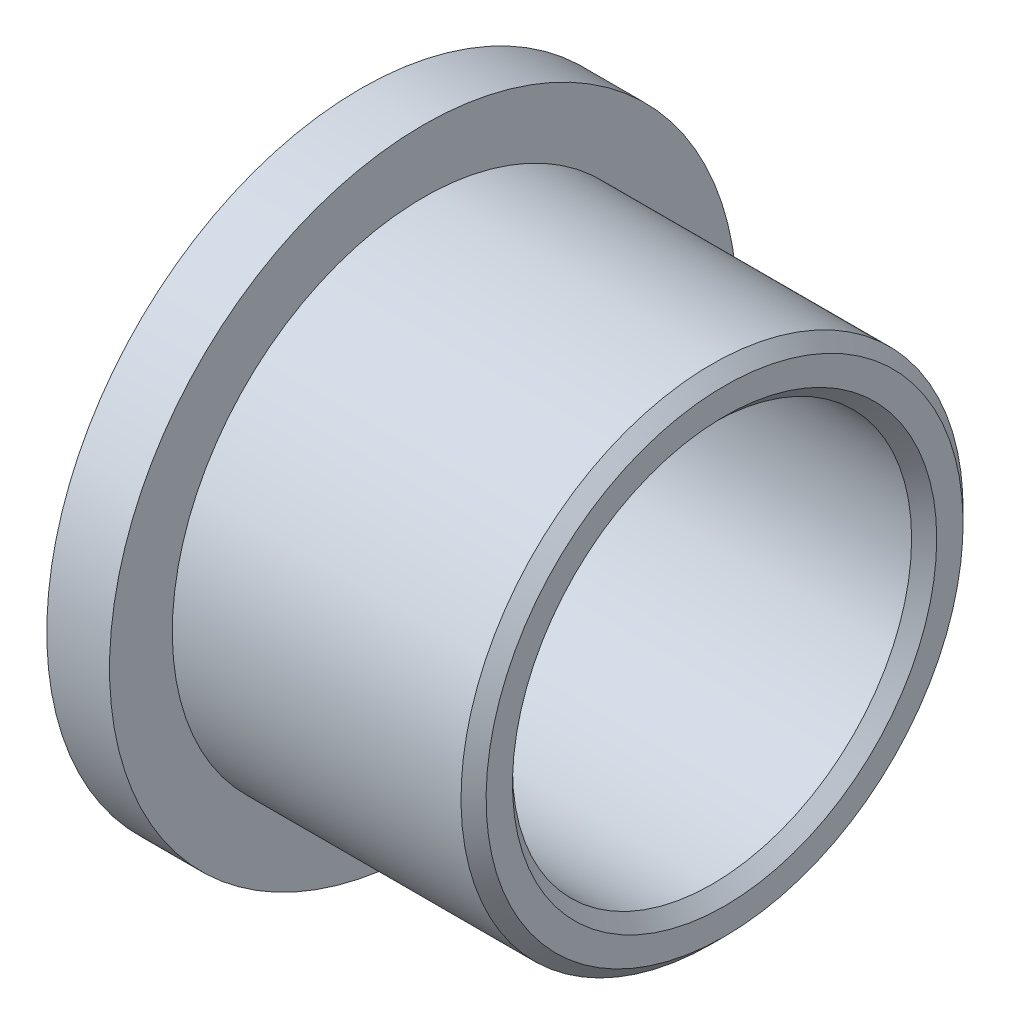
ISO-10303-21;
HEADER;
FILE_DESCRIPTION(('STEP AP214'),'2;1');
FILE_NAME('part.step','',(''),(''),'','','');
FILE_SCHEMA(('AUTOMOTIVE_DESIGN { 1 0 10303 214 1 1 1 1 }'));
ENDSEC;
DATA;
#1=APPLICATION_CONTEXT('core data for automotive mechanical design processes');
#2=APPLICATION_PROTOCOL_DEFINITION('international standard','automotive_design',2000,#1);
#3=PRODUCT_CONTEXT('',#1,'mechanical');
#4=PRODUCT('Part','Part','',(#3));
#5=PRODUCT_RELATED_PRODUCT_CATEGORY('part','',(#4));
#6=PRODUCT_DEFINITION_FORMATION('','',#4);
#7=PRODUCT_DEFINITION_CONTEXT('part definition',#1,'design');
#8=PRODUCT_DEFINITION('design','',#6,#7);
#9=PRODUCT_DEFINITION_SHAPE('','',#8);
#10=(LENGTH_UNIT() NAMED_UNIT(*) SI_UNIT(.MILLI.,.METRE.));
#11=(NAMED_UNIT(*) PLANE_ANGLE_UNIT() SI_UNIT($,.RADIAN.));
#12=(NAMED_UNIT(*) SI_UNIT($,.STERADIAN.) SOLID_ANGLE_UNIT());
#13=UNCERTAINTY_MEASURE_WITH_UNIT(LENGTH_MEASURE(1.E-05),#10,'distance_accuracy_value','');
#14=(GEOMETRIC_REPRESENTATION_CONTEXT(3) GLOBAL_UNCERTAINTY_ASSIGNED_CONTEXT((#13)) GLOBAL_UNIT_ASSIGNED_CONTEXT((#10,
#11,#12)) REPRESENTATION_CONTEXT('',''));
#15=CARTESIAN_POINT('',(0.,0.,0.));
#16=DIRECTION('',(0.,0.,1.));
#17=DIRECTION('',(1.,0.,0.));
#18=AXIS2_PLACEMENT_3D('',#15,#16,#17);
#19=CARTESIAN_POINT('',(0.,0.,0.));
#20=DIRECTION('',(1.,0.,0.));
#21=DIRECTION('',(0.,1.00000000000001,0.));
#22=AXIS2_PLACEMENT_3D('',#19,#20,#21);
#23=PLANE('',#22);
#24=CARTESIAN_POINT('',(0.,0.,0.));
#25=DIRECTION('',(1.,0.,0.));
#26=DIRECTION('',(0.,1.00000000000001,0.));
#27=AXIS2_PLACEMENT_3D('',#24,#25,#26);
#28=CIRCLE('',#27,8.45);
#29=CARTESIAN_POINT('',(0.,8.4500000000001,0.));
#30=VERTEX_POINT('',#29);
#31=EDGE_CURVE('E66',#30,#30,#28,.T.);
#32=ORIENTED_EDGE('',*,*,#31,.T.);
#33=EDGE_LOOP('',(#32));
#34=FACE_BOUND('',#33,.T.);
#35=CARTESIAN_POINT('',(0.,0.,0.));
#36=DIRECTION('',(-1.,0.,0.));
#37=DIRECTION('',(0.,-1.00000000000001,0.));
#38=AXIS2_PLACEMENT_3D('',#35,#36,#37);
#39=CIRCLE('',#38,12.5);
#40=CARTESIAN_POINT('',(0.,-12.5000000000001,0.));
#41=VERTEX_POINT('',#40);
#42=EDGE_CURVE('E69',#41,#41,#39,.T.);
#43=ORIENTED_EDGE('',*,*,#42,.T.);
#44=EDGE_LOOP('',(#43));
#45=FACE_BOUND('',#44,.T.);
#46=ADVANCED_FACE('F43',(#34,#45),#23,.F.);
#47=CARTESIAN_POINT('',(-19.5397532603566,1.04083408558608E-13,1.94289029309402E-13));
#48=DIRECTION('',(-1.,0.,0.));
#49=DIRECTION('',(0.,-1.00000000000001,0.));
#50=AXIS2_PLACEMENT_3D('',#47,#48,#49);
#51=CYLINDRICAL_SURFACE('',#50,12.5);
#52=ORIENTED_EDGE('',*,*,#42,.F.);
#53=EDGE_LOOP('',(#52));
#54=FACE_BOUND('',#53,.T.);
#55=CARTESIAN_POINT('',(2.5,0.,0.));
#56=DIRECTION('',(-1.,0.,0.));
#57=DIRECTION('',(0.,-1.00000000000001,0.));
#58=AXIS2_PLACEMENT_3D('',#55,#56,#57);
#59=CIRCLE('',#58,12.5);
#60=CARTESIAN_POINT('',(2.50000000000007,-12.5000000000001,0.));
#61=VERTEX_POINT('',#60);
#62=EDGE_CURVE('E72',#61,#61,#59,.T.);
#63=ORIENTED_EDGE('',*,*,#62,.T.);
#64=EDGE_LOOP('',(#63));
#65=FACE_BOUND('',#64,.T.);
#66=ADVANCED_FACE('F92',(#54,#65),#51,.T.);
#67=CARTESIAN_POINT('',(2.49999999999989,12.5000000000001,0.));
#68=DIRECTION('',(-1.,0.,0.));
#69=DIRECTION('',(0.,-1.00000000000001,0.));
#70=AXIS2_PLACEMENT_3D('',#67,#68,#69);
#71=PLANE('',#70);
#72=ORIENTED_EDGE('',*,*,#62,.F.);
#73=EDGE_LOOP('',(#72));
#74=FACE_BOUND('',#73,.T.);
#75=CARTESIAN_POINT('',(2.50000000000001,0.,0.));
#76=DIRECTION('',(-1.,0.,0.));
#77=DIRECTION('',(0.,-1.00000000000001,0.));
#78=AXIS2_PLACEMENT_3D('',#75,#76,#77);
#79=CIRCLE('',#78,10.);
#80=CARTESIAN_POINT('',(2.50000000000006,-10.0000000000001,0.));
#81=VERTEX_POINT('',#80);
#82=EDGE_CURVE('E75',#81,#81,#79,.T.);
#83=ORIENTED_EDGE('',*,*,#82,.T.);
#84=EDGE_LOOP('',(#83));
#85=FACE_BOUND('',#84,.T.);
#86=ADVANCED_FACE('F79',(#74,#85),#71,.F.);
#87=CARTESIAN_POINT('',(-19.5397532603566,1.04083408558608E-13,1.94289029309402E-13));
#88=DIRECTION('',(-1.,0.,0.));
#89=DIRECTION('',(0.,-1.00000000000001,0.));
#90=AXIS2_PLACEMENT_3D('',#87,#88,#89);
#91=CYLINDRICAL_SURFACE('',#90,9.99999999999999);
#92=CARTESIAN_POINT('',(14.,0.,0.));
#93=DIRECTION('',(-1.,0.,0.));
#94=DIRECTION('',(0.,-1.00000000000001,0.));
#95=AXIS2_PLACEMENT_3D('',#92,#93,#94);
#96=CIRCLE('',#95,9.99999999999999);
#97=CARTESIAN_POINT('',(14.,-10.0000000000001,0.));
#98=VERTEX_POINT('',#97);
#99=EDGE_CURVE('E54',#98,#98,#96,.T.);
#100=ORIENTED_EDGE('',*,*,#99,.T.);
#101=EDGE_LOOP('',(#100));
#102=FACE_BOUND('',#101,.T.);
#103=ORIENTED_EDGE('',*,*,#82,.F.);
#104=EDGE_LOOP('',(#103));
#105=FACE_BOUND('',#104,.T.);
#106=ADVANCED_FACE('F81',(#102,#105),#91,.T.);
#107=CARTESIAN_POINT('',(14.5,10.,0.));
#108=DIRECTION('',(-1.,0.,0.));
#109=DIRECTION('',(0.,-1.00000000000001,0.));
#110=AXIS2_PLACEMENT_3D('',#107,#108,#109);
#111=PLANE('',#110);
#112=CARTESIAN_POINT('',(14.5,0.,0.));
#113=DIRECTION('',(-1.,0.,0.));
#114=DIRECTION('',(0.,-1.00000000000001,0.));
#115=AXIS2_PLACEMENT_3D('',#112,#113,#114);
#116=CIRCLE('',#115,9.49999999999999);
#117=CARTESIAN_POINT('',(14.5000000000001,-9.50000000000009,0.));
#118=VERTEX_POINT('',#117);
#119=EDGE_CURVE('E12',#118,#118,#116,.F.);
#120=ORIENTED_EDGE('',*,*,#119,.T.);
#121=EDGE_LOOP('',(#120));
#122=FACE_BOUND('',#121,.T.);
#123=CARTESIAN_POINT('',(14.5,0.,0.));
#124=DIRECTION('',(-1.,0.,0.));
#125=DIRECTION('',(0.,-1.00000000000001,0.));
#126=AXIS2_PLACEMENT_3D('',#123,#124,#125);
#127=CIRCLE('',#126,8.45000000000001);
#128=CARTESIAN_POINT('',(14.5000000000001,-8.4500000000001,0.));
#129=VERTEX_POINT('',#128);
#130=EDGE_CURVE('E50',#129,#129,#127,.T.);
#131=ORIENTED_EDGE('',*,*,#130,.T.);
#132=EDGE_LOOP('',(#131));
#133=FACE_BOUND('',#132,.T.);
#134=ADVANCED_FACE('F83',(#122,#133),#111,.F.);
#135=CARTESIAN_POINT('',(14.5,0.,0.));
#136=DIRECTION('',(1.,0.,0.));
#137=DIRECTION('',(0.,0.,-1.));
#138=AXIS2_PLACEMENT_3D('',#135,#136,#137);
#139=CYLINDRICAL_SURFACE('',#138,7.95);
#140=CARTESIAN_POINT('',(0.500000000000007,0.,0.));
#141=DIRECTION('',(1.,0.,0.));
#142=DIRECTION('',(0.,0.,-1.));
#143=AXIS2_PLACEMENT_3D('',#140,#141,#142);
#144=CIRCLE('',#143,7.95);
#145=CARTESIAN_POINT('',(0.500000000000062,0.,-7.95));
#146=VERTEX_POINT('',#145);
#147=EDGE_CURVE('E58',#146,#146,#144,.F.);
#148=ORIENTED_EDGE('',*,*,#147,.T.);
#149=EDGE_LOOP('',(#148));
#150=FACE_BOUND('',#149,.T.);
#151=CARTESIAN_POINT('',(14.,0.,0.));
#152=DIRECTION('',(-1.,0.,0.));
#153=DIRECTION('',(0.,0.,1.));
#154=AXIS2_PLACEMENT_3D('',#151,#152,#153);
#155=CIRCLE('',#154,7.95);
#156=CARTESIAN_POINT('',(13.9999999999999,0.,7.95));
#157=VERTEX_POINT('',#156);
#158=EDGE_CURVE('E63',#157,#157,#155,.F.);
#159=ORIENTED_EDGE('',*,*,#158,.T.);
#160=EDGE_LOOP('',(#159));
#161=FACE_BOUND('',#160,.T.);
#162=ADVANCED_FACE('F90',(#150,#161),#139,.F.);
#163=CARTESIAN_POINT('',(0.,0.,0.));
#164=DIRECTION('',(-1.,0.,0.));
#165=DIRECTION('',(0.,0.,1.));
#166=AXIS2_PLACEMENT_3D('',#163,#164,#165);
#167=CONICAL_SURFACE('',#166,8.45,0.785398163397447);
#168=ORIENTED_EDGE('',*,*,#147,.F.);
#169=EDGE_LOOP('',(#168));
#170=FACE_BOUND('',#169,.T.);
#171=ORIENTED_EDGE('',*,*,#31,.F.);
#172=EDGE_LOOP('',(#171));
#173=FACE_BOUND('',#172,.T.);
#174=ADVANCED_FACE('F105',(#170,#173),#167,.F.);
#175=CARTESIAN_POINT('',(14.,0.,0.));
#176=DIRECTION('',(-1.,0.,0.));
#177=DIRECTION('',(0.,-1.00000000000001,0.));
#178=AXIS2_PLACEMENT_3D('',#175,#176,#177);
#179=CONICAL_SURFACE('',#178,9.99999999999999,0.78539816339745);
#180=ORIENTED_EDGE('',*,*,#119,.F.);
#181=EDGE_LOOP('',(#180));
#182=FACE_BOUND('',#181,.T.);
#183=ORIENTED_EDGE('',*,*,#99,.F.);
#184=EDGE_LOOP('',(#183));
#185=FACE_BOUND('',#184,.T.);
#186=ADVANCED_FACE('F107',(#182,#185),#179,.T.);
#187=CARTESIAN_POINT('',(14.,0.,0.));
#188=DIRECTION('',(1.,0.,0.));
#189=DIRECTION('',(0.,0.,-1.));
#190=AXIS2_PLACEMENT_3D('',#187,#188,#189);
#191=CONICAL_SURFACE('',#190,7.95,0.78539816339745);
#192=ORIENTED_EDGE('',*,*,#130,.F.);
#193=EDGE_LOOP('',(#192));
#194=FACE_BOUND('',#193,.T.);
#195=ORIENTED_EDGE('',*,*,#158,.F.);
#196=EDGE_LOOP('',(#195));
#197=FACE_BOUND('',#196,.T.);
#198=ADVANCED_FACE('F45',(#194,#197),#191,.F.);
#199=CLOSED_SHELL('',(#46,#66,#86,#106,#134,#162,#174,#186,#198));
#200=MANIFOLD_SOLID_BREP('B2',#199);
#201=ADVANCED_BREP_SHAPE_REPRESENTATION('',(#18,#200),#14);
#202=SHAPE_DEFINITION_REPRESENTATION(#9,#201);
ENDSEC;
END-ISO-10303-21;
